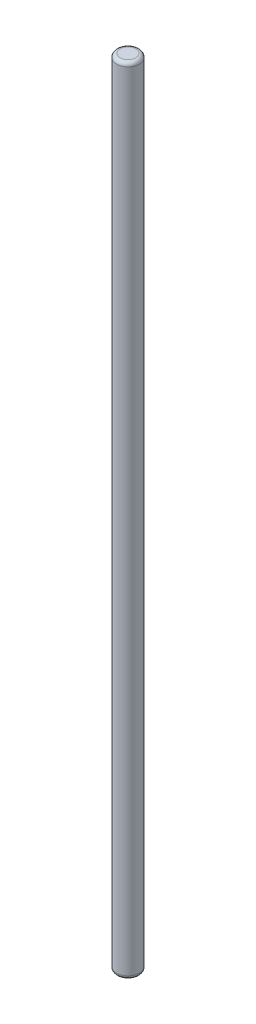
ISO-10303-21;
HEADER;
FILE_DESCRIPTION(('STEP AP214'),'2;1');
FILE_NAME('part.step','',(''),(''),'','','');
FILE_SCHEMA(('AUTOMOTIVE_DESIGN { 1 0 10303 214 1 1 1 1 }'));
ENDSEC;
DATA;
#1=APPLICATION_CONTEXT('core data for automotive mechanical design processes');
#2=APPLICATION_PROTOCOL_DEFINITION('international standard','automotive_design',2000,#1);
#3=PRODUCT_CONTEXT('',#1,'mechanical');
#4=PRODUCT('Part','Part','',(#3));
#5=PRODUCT_RELATED_PRODUCT_CATEGORY('part','',(#4));
#6=PRODUCT_DEFINITION_FORMATION('','',#4);
#7=PRODUCT_DEFINITION_CONTEXT('part definition',#1,'design');
#8=PRODUCT_DEFINITION('design','',#6,#7);
#9=PRODUCT_DEFINITION_SHAPE('','',#8);
#10=(LENGTH_UNIT() NAMED_UNIT(*) SI_UNIT(.MILLI.,.METRE.));
#11=(NAMED_UNIT(*) PLANE_ANGLE_UNIT() SI_UNIT($,.RADIAN.));
#12=(NAMED_UNIT(*) SI_UNIT($,.STERADIAN.) SOLID_ANGLE_UNIT());
#13=UNCERTAINTY_MEASURE_WITH_UNIT(LENGTH_MEASURE(1.E-05),#10,'distance_accuracy_value','');
#14=(GEOMETRIC_REPRESENTATION_CONTEXT(3) GLOBAL_UNCERTAINTY_ASSIGNED_CONTEXT((#13)) GLOBAL_UNIT_ASSIGNED_CONTEXT((#10,
#11,#12)) REPRESENTATION_CONTEXT('',''));
#15=CARTESIAN_POINT('',(0.,0.,0.));
#16=DIRECTION('',(0.,0.,1.));
#17=DIRECTION('',(1.,0.,0.));
#18=AXIS2_PLACEMENT_3D('',#15,#16,#17);
#19=CARTESIAN_POINT('',(0.,165.1,0.));
#20=DIRECTION('',(0.,-1.,0.));
#21=DIRECTION('',(0.,0.,-1.));
#22=AXIS2_PLACEMENT_3D('',#19,#20,#21);
#23=CYLINDRICAL_SURFACE('',#22,2.38125);
#24=CARTESIAN_POINT('',(0.,0.762000000000013,0.));
#25=DIRECTION('',(0.,1.,0.));
#26=DIRECTION('',(0.,0.,1.));
#27=AXIS2_PLACEMENT_3D('',#24,#25,#26);
#28=CIRCLE('',#27,2.38125);
#29=CARTESIAN_POINT('',(0.,0.762000000000013,2.38125));
#30=VERTEX_POINT('',#29);
#31=EDGE_CURVE('E42',#30,#30,#28,.T.);
#32=ORIENTED_EDGE('',*,*,#31,.T.);
#33=EDGE_LOOP('',(#32));
#34=FACE_BOUND('',#33,.T.);
#35=CARTESIAN_POINT('',(0.,164.338,0.));
#36=DIRECTION('',(0.,1.,0.));
#37=DIRECTION('',(0.,0.,1.));
#38=AXIS2_PLACEMENT_3D('',#35,#36,#37);
#39=CIRCLE('',#38,2.38125);
#40=CARTESIAN_POINT('',(0.,164.338,2.38125));
#41=VERTEX_POINT('',#40);
#42=EDGE_CURVE('E46',#41,#41,#39,.F.);
#43=ORIENTED_EDGE('',*,*,#42,.T.);
#44=EDGE_LOOP('',(#43));
#45=FACE_BOUND('',#44,.T.);
#46=ADVANCED_FACE('F31',(#34,#45),#23,.T.);
#47=CARTESIAN_POINT('',(0.,165.1,0.));
#48=DIRECTION('',(0.,1.,0.));
#49=DIRECTION('',(0.,0.,1.));
#50=AXIS2_PLACEMENT_3D('',#47,#48,#49);
#51=PLANE('',#50);
#52=CARTESIAN_POINT('',(0.,165.1,0.));
#53=DIRECTION('',(0.,1.,0.));
#54=DIRECTION('',(0.,0.,1.));
#55=AXIS2_PLACEMENT_3D('',#52,#53,#54);
#56=CIRCLE('',#55,1.61925);
#57=CARTESIAN_POINT('',(0.,165.1,1.61925));
#58=VERTEX_POINT('',#57);
#59=EDGE_CURVE('E10',#58,#58,#56,.T.);
#60=ORIENTED_EDGE('',*,*,#59,.T.);
#61=EDGE_LOOP('',(#60));
#62=FACE_BOUND('',#61,.T.);
#63=ADVANCED_FACE('F62',(#62),#51,.T.);
#64=CARTESIAN_POINT('',(0.,0.,0.));
#65=DIRECTION('',(0.,1.,0.));
#66=DIRECTION('',(0.,0.,1.));
#67=AXIS2_PLACEMENT_3D('',#64,#65,#66);
#68=PLANE('',#67);
#69=CARTESIAN_POINT('',(0.,0.,0.));
#70=DIRECTION('',(0.,1.,0.));
#71=DIRECTION('',(0.,0.,1.));
#72=AXIS2_PLACEMENT_3D('',#69,#70,#71);
#73=CIRCLE('',#72,1.61925);
#74=CARTESIAN_POINT('',(0.,0.,1.61925));
#75=VERTEX_POINT('',#74);
#76=EDGE_CURVE('E38',#75,#75,#73,.F.);
#77=ORIENTED_EDGE('',*,*,#76,.T.);
#78=EDGE_LOOP('',(#77));
#79=FACE_BOUND('',#78,.T.);
#80=ADVANCED_FACE('F59',(#79),#68,.F.);
#81=CARTESIAN_POINT('',(0.,0.762000000000013,0.));
#82=DIRECTION('',(0.,1.,0.));
#83=DIRECTION('',(0.,0.,1.));
#84=AXIS2_PLACEMENT_3D('',#81,#82,#83);
#85=TOROIDAL_SURFACE('',#84,1.61925,0.762);
#86=ORIENTED_EDGE('',*,*,#76,.F.);
#87=EDGE_LOOP('',(#86));
#88=FACE_BOUND('',#87,.T.);
#89=ORIENTED_EDGE('',*,*,#31,.F.);
#90=EDGE_LOOP('',(#89));
#91=FACE_BOUND('',#90,.T.);
#92=ADVANCED_FACE('F55',(#88,#91),#85,.T.);
#93=CARTESIAN_POINT('',(0.,164.338,0.));
#94=DIRECTION('',(0.,1.,0.));
#95=DIRECTION('',(0.,0.,1.));
#96=AXIS2_PLACEMENT_3D('',#93,#94,#95);
#97=TOROIDAL_SURFACE('',#96,1.61925,0.762);
#98=ORIENTED_EDGE('',*,*,#42,.F.);
#99=EDGE_LOOP('',(#98));
#100=FACE_BOUND('',#99,.T.);
#101=ORIENTED_EDGE('',*,*,#59,.F.);
#102=EDGE_LOOP('',(#101));
#103=FACE_BOUND('',#102,.T.);
#104=ADVANCED_FACE('F33',(#100,#103),#97,.T.);
#105=CLOSED_SHELL('',(#46,#63,#80,#92,#104));
#106=MANIFOLD_SOLID_BREP('B2',#105);
#107=ADVANCED_BREP_SHAPE_REPRESENTATION('',(#18,#106),#14);
#108=SHAPE_DEFINITION_REPRESENTATION(#9,#107);
ENDSEC;
END-ISO-10303-21;
